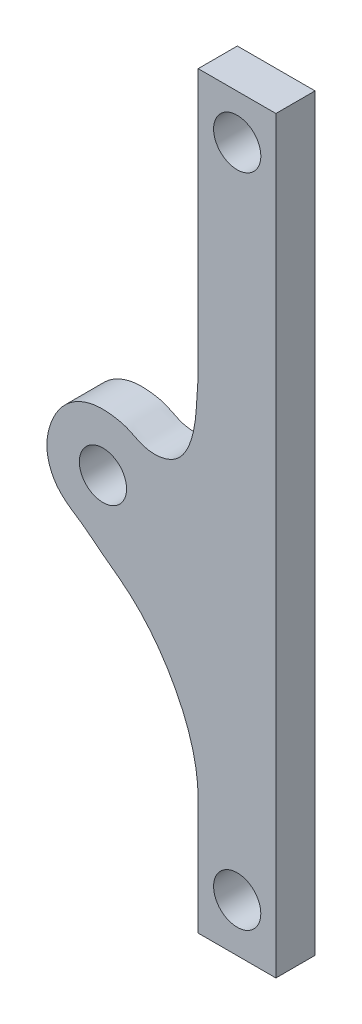
ISO-10303-21;
HEADER;
FILE_DESCRIPTION(('STEP AP214'),'2;1');
FILE_NAME('part.step','',(''),(''),'','','');
FILE_SCHEMA(('AUTOMOTIVE_DESIGN { 1 0 10303 214 1 1 1 1 }'));
ENDSEC;
DATA;
#1=APPLICATION_CONTEXT('core data for automotive mechanical design processes');
#2=APPLICATION_PROTOCOL_DEFINITION('international standard','automotive_design',2000,#1);
#3=PRODUCT_CONTEXT('',#1,'mechanical');
#4=PRODUCT('Part','Part','',(#3));
#5=PRODUCT_RELATED_PRODUCT_CATEGORY('part','',(#4));
#6=PRODUCT_DEFINITION_FORMATION('','',#4);
#7=PRODUCT_DEFINITION_CONTEXT('part definition',#1,'design');
#8=PRODUCT_DEFINITION('design','',#6,#7);
#9=PRODUCT_DEFINITION_SHAPE('','',#8);
#10=(LENGTH_UNIT() NAMED_UNIT(*) SI_UNIT(.MILLI.,.METRE.));
#11=(NAMED_UNIT(*) PLANE_ANGLE_UNIT() SI_UNIT($,.RADIAN.));
#12=(NAMED_UNIT(*) SI_UNIT($,.STERADIAN.) SOLID_ANGLE_UNIT());
#13=UNCERTAINTY_MEASURE_WITH_UNIT(LENGTH_MEASURE(1.E-05),#10,'distance_accuracy_value','');
#14=(GEOMETRIC_REPRESENTATION_CONTEXT(3) GLOBAL_UNCERTAINTY_ASSIGNED_CONTEXT((#13)) GLOBAL_UNIT_ASSIGNED_CONTEXT((#10,
#11,#12)) REPRESENTATION_CONTEXT('',''));
#15=CARTESIAN_POINT('',(0.,0.,0.));
#16=DIRECTION('',(0.,0.,1.));
#17=DIRECTION('',(1.,0.,0.));
#18=AXIS2_PLACEMENT_3D('',#15,#16,#17);
#19=CARTESIAN_POINT('',(14.3241601278238,9.85253651703689,2.53));
#20=CARTESIAN_POINT('',(14.329457987155,11.8171616213795,2.53));
#21=CARTESIAN_POINT('',(13.2118954990796,15.314671373828,2.53));
#22=CARTESIAN_POINT('',(10.5227436913193,18.8487191588496,2.53));
#23=CARTESIAN_POINT('',(8.13326193199438,20.4876335551474,2.53));
#24=CARTESIAN_POINT('',(6.78454321832392,21.6322267702998,2.53));
#25=CARTESIAN_POINT('',(5.3437883414213,22.4556992123123,2.53));
#26=CARTESIAN_POINT('',(4.34815831766203,24.277098970188,2.53));
#27=CARTESIAN_POINT('',(4.70477046266301,26.4127424818023,2.53));
#28=CARTESIAN_POINT('',(5.97966936213651,28.1104366216431,2.53));
#29=CARTESIAN_POINT('',(7.48996229676358,28.6692912361335,2.53));
#30=CARTESIAN_POINT('',(8.73588194584117,28.6113653945058,2.53));
#31=CARTESIAN_POINT('',(9.72355422953002,28.4327084800523,2.53));
#32=CARTESIAN_POINT('',(10.5650873261809,27.9118096328136,2.53));
#33=CARTESIAN_POINT('',(11.7145107145276,27.6803174652671,2.53));
#34=CARTESIAN_POINT('',(12.9767761080277,28.0655402375854,2.53));
#35=CARTESIAN_POINT('',(14.3182366534119,30.1466805784571,2.53));
#36=CARTESIAN_POINT('',(14.1884069634423,32.1450848120604,2.53));
#37=CARTESIAN_POINT('',(14.3241601278238,33.5611234431157,2.53));
#38=B_SPLINE_CURVE_WITH_KNOTS('',3,(#19,#20,#21,#22,#23,#24,#25,#26,#27,#28,#29,#30,#31,#32,#33,
#34,#35,#36,#37),.UNSPECIFIED.,.F.,.F.,(4,1,1,1,1,1,1,1,1,1,1,1,1,1,1,1,4),(0.,
0.165877522271735,0.310250800673476,0.370355979087688,0.413778475722413,0.462189974270297,
0.510332351118032,0.581700783630295,0.634410755249737,0.686591695711737,0.711498906896285,
0.741308267119988,0.771463134737927,0.795069042742029,0.840627944082532,0.873607157391937,1.),.UNSPECIFIED.);
#39=DIRECTION('',(0.,0.,-1.));
#40=VECTOR('',#39,1.);
#41=SURFACE_OF_LINEAR_EXTRUSION('',#38,#40);
#42=CARTESIAN_POINT('',(14.3241601278238,9.85253651703689,0.));
#43=CARTESIAN_POINT('',(14.329457987155,11.8171616213795,0.));
#44=CARTESIAN_POINT('',(13.2118954990796,15.314671373828,0.));
#45=CARTESIAN_POINT('',(10.5227436913193,18.8487191588496,0.));
#46=CARTESIAN_POINT('',(8.13326193199438,20.4876335551474,0.));
#47=CARTESIAN_POINT('',(6.78454321832392,21.6322267702998,0.));
#48=CARTESIAN_POINT('',(5.3437883414213,22.4556992123123,0.));
#49=CARTESIAN_POINT('',(4.34815831766203,24.277098970188,0.));
#50=CARTESIAN_POINT('',(4.70477046266301,26.4127424818023,0.));
#51=CARTESIAN_POINT('',(5.97966936213651,28.1104366216431,0.));
#52=CARTESIAN_POINT('',(7.48996229676358,28.6692912361335,0.));
#53=CARTESIAN_POINT('',(8.73588194584117,28.6113653945058,0.));
#54=CARTESIAN_POINT('',(9.72355422953002,28.4327084800523,0.));
#55=CARTESIAN_POINT('',(10.5650873261809,27.9118096328136,0.));
#56=CARTESIAN_POINT('',(11.7145107145276,27.6803174652671,0.));
#57=CARTESIAN_POINT('',(12.9767761080277,28.0655402375854,0.));
#58=CARTESIAN_POINT('',(14.3182366534119,30.1466805784571,0.));
#59=CARTESIAN_POINT('',(14.1884069634423,32.1450848120604,0.));
#60=CARTESIAN_POINT('',(14.3241601278238,33.5611234431157,0.));
#61=B_SPLINE_CURVE_WITH_KNOTS('',3,(#42,#43,#44,#45,#46,#47,#48,#49,#50,#51,#52,#53,#54,#55,#56,
#57,#58,#59,#60),.UNSPECIFIED.,.F.,.F.,(4,1,1,1,1,1,1,1,1,1,1,1,1,1,1,1,4),(0.,
0.165877522271735,0.310250800673476,0.370355979087688,0.413778475722413,0.462189974270297,
0.510332351118032,0.581700783630295,0.634410755249737,0.686591695711737,0.711498906896285,
0.741308267119988,0.771463134737927,0.795069042742029,0.840627944082532,0.873607157391937,1.),.UNSPECIFIED.);
#62=CARTESIAN_POINT('',(14.3241601278238,9.85253651703689,0.));
#63=VERTEX_POINT('',#62);
#64=CARTESIAN_POINT('',(14.3241601278238,33.5611234431157,0.));
#65=VERTEX_POINT('',#64);
#66=EDGE_CURVE('E127',#63,#65,#61,.T.);
#67=ORIENTED_EDGE('',*,*,#66,.F.);
#68=DIRECTION('',(0.,0.,-1.));
#69=VECTOR('',#68,1.);
#70=CARTESIAN_POINT('',(14.3241601278238,9.85253651703689,2.53));
#71=LINE('',#70,#69);
#72=CARTESIAN_POINT('',(14.3241601278238,9.85253651703689,2.53));
#73=VERTEX_POINT('',#72);
#74=EDGE_CURVE('E11',#73,#63,#71,.T.);
#75=ORIENTED_EDGE('',*,*,#74,.F.);
#76=CARTESIAN_POINT('',(14.3241601278238,33.5611234431157,2.53));
#77=VERTEX_POINT('',#76);
#78=EDGE_CURVE('E151',#73,#77,#38,.T.);
#79=ORIENTED_EDGE('',*,*,#78,.T.);
#80=DIRECTION('',(0.,0.,-1.));
#81=VECTOR('',#80,1.);
#82=CARTESIAN_POINT('',(14.3241601278238,33.5611234431157,2.53));
#83=LINE('',#82,#81);
#84=EDGE_CURVE('E83',#77,#65,#83,.T.);
#85=ORIENTED_EDGE('',*,*,#84,.T.);
#86=EDGE_LOOP('',(#67,#75,#79,#85));
#87=FACE_BOUND('',#86,.T.);
#88=ADVANCED_FACE('F38',(#87),#41,.T.);
#89=CARTESIAN_POINT('',(14.3241601278238,0.,2.53));
#90=DIRECTION('',(1.,0.,0.));
#91=DIRECTION('',(0.,0.,-1.));
#92=AXIS2_PLACEMENT_3D('',#89,#90,#91);
#93=PLANE('',#92);
#94=DIRECTION('',(0.,-1.,0.));
#95=VECTOR('',#94,1.);
#96=CARTESIAN_POINT('',(14.3241601278238,0.,0.));
#97=LINE('',#96,#95);
#98=CARTESIAN_POINT('',(14.3241601278238,2.39854936115329,0.));
#99=VERTEX_POINT('',#98);
#100=EDGE_CURVE('E132',#63,#99,#97,.T.);
#101=ORIENTED_EDGE('',*,*,#100,.T.);
#102=DIRECTION('',(0.,0.,-1.));
#103=VECTOR('',#102,1.);
#104=CARTESIAN_POINT('',(14.3241601278238,2.39854936115329,2.53));
#105=LINE('',#104,#103);
#106=CARTESIAN_POINT('',(14.3241601278238,2.39854936115329,2.53));
#107=VERTEX_POINT('',#106);
#108=EDGE_CURVE('E47',#107,#99,#105,.T.);
#109=ORIENTED_EDGE('',*,*,#108,.F.);
#110=DIRECTION('',(0.,-1.,0.));
#111=VECTOR('',#110,1.);
#112=CARTESIAN_POINT('',(14.3241601278238,0.,2.53));
#113=LINE('',#112,#111);
#114=EDGE_CURVE('E117',#73,#107,#113,.T.);
#115=ORIENTED_EDGE('',*,*,#114,.F.);
#116=ORIENTED_EDGE('',*,*,#74,.T.);
#117=EDGE_LOOP('',(#101,#109,#115,#116));
#118=FACE_BOUND('',#117,.T.);
#119=ADVANCED_FACE('F160',(#118),#93,.F.);
#120=CARTESIAN_POINT('',(0.,2.39854936115329,2.53));
#121=DIRECTION('',(0.,-1.,0.));
#122=DIRECTION('',(0.,0.,-1.));
#123=AXIS2_PLACEMENT_3D('',#120,#121,#122);
#124=PLANE('',#123);
#125=DIRECTION('',(-1.,0.,0.));
#126=VECTOR('',#125,1.);
#127=CARTESIAN_POINT('',(0.,2.39854936115329,0.));
#128=LINE('',#127,#126);
#129=CARTESIAN_POINT('',(19.3441601278238,2.39854936115329,0.));
#130=VERTEX_POINT('',#129);
#131=EDGE_CURVE('E139',#130,#99,#128,.T.);
#132=ORIENTED_EDGE('',*,*,#131,.F.);
#133=DIRECTION('',(0.,0.,-1.));
#134=VECTOR('',#133,1.);
#135=CARTESIAN_POINT('',(19.3441601278238,2.39854936115329,2.53));
#136=LINE('',#135,#134);
#137=CARTESIAN_POINT('',(19.3441601278238,2.39854936115329,2.53));
#138=VERTEX_POINT('',#137);
#139=EDGE_CURVE('E105',#138,#130,#136,.T.);
#140=ORIENTED_EDGE('',*,*,#139,.F.);
#141=DIRECTION('',(-1.,0.,0.));
#142=VECTOR('',#141,1.);
#143=CARTESIAN_POINT('',(0.,2.39854936115329,2.53));
#144=LINE('',#143,#142);
#145=EDGE_CURVE('E115',#138,#107,#144,.T.);
#146=ORIENTED_EDGE('',*,*,#145,.T.);
#147=ORIENTED_EDGE('',*,*,#108,.T.);
#148=EDGE_LOOP('',(#132,#140,#146,#147));
#149=FACE_BOUND('',#148,.T.);
#150=ADVANCED_FACE('F157',(#149),#124,.T.);
#151=CARTESIAN_POINT('',(19.3441601278238,0.,2.53));
#152=DIRECTION('',(1.,0.,0.));
#153=DIRECTION('',(0.,0.,-1.));
#154=AXIS2_PLACEMENT_3D('',#151,#152,#153);
#155=PLANE('',#154);
#156=DIRECTION('',(0.,-1.,0.));
#157=VECTOR('',#156,1.);
#158=CARTESIAN_POINT('',(19.3441601278238,0.,0.));
#159=LINE('',#158,#157);
#160=CARTESIAN_POINT('',(19.3441601278238,50.7585493611533,0.));
#161=VERTEX_POINT('',#160);
#162=EDGE_CURVE('E104',#161,#130,#159,.T.);
#163=ORIENTED_EDGE('',*,*,#162,.F.);
#164=DIRECTION('',(0.,0.,-1.));
#165=VECTOR('',#164,1.);
#166=CARTESIAN_POINT('',(19.3441601278238,50.7585493611533,2.53));
#167=LINE('',#166,#165);
#168=CARTESIAN_POINT('',(19.3441601278238,50.7585493611533,2.53));
#169=VERTEX_POINT('',#168);
#170=EDGE_CURVE('E98',#169,#161,#167,.T.);
#171=ORIENTED_EDGE('',*,*,#170,.F.);
#172=DIRECTION('',(0.,-1.,0.));
#173=VECTOR('',#172,1.);
#174=CARTESIAN_POINT('',(19.3441601278238,0.,2.53));
#175=LINE('',#174,#173);
#176=EDGE_CURVE('E102',#169,#138,#175,.T.);
#177=ORIENTED_EDGE('',*,*,#176,.T.);
#178=ORIENTED_EDGE('',*,*,#139,.T.);
#179=EDGE_LOOP('',(#163,#171,#177,#178));
#180=FACE_BOUND('',#179,.T.);
#181=ADVANCED_FACE('F100',(#180),#155,.T.);
#182=CARTESIAN_POINT('',(0.,50.7585493611533,2.53));
#183=DIRECTION('',(0.,-1.,0.));
#184=DIRECTION('',(0.,0.,-1.));
#185=AXIS2_PLACEMENT_3D('',#182,#183,#184);
#186=PLANE('',#185);
#187=DIRECTION('',(-1.,0.,0.));
#188=VECTOR('',#187,1.);
#189=CARTESIAN_POINT('',(0.,50.7585493611533,0.));
#190=LINE('',#189,#188);
#191=CARTESIAN_POINT('',(14.3241601278238,50.7585493611533,0.));
#192=VERTEX_POINT('',#191);
#193=EDGE_CURVE('E76',#161,#192,#190,.T.);
#194=ORIENTED_EDGE('',*,*,#193,.T.);
#195=DIRECTION('',(0.,0.,-1.));
#196=VECTOR('',#195,1.);
#197=CARTESIAN_POINT('',(14.3241601278238,50.7585493611533,2.53));
#198=LINE('',#197,#196);
#199=CARTESIAN_POINT('',(14.3241601278238,50.7585493611533,2.53));
#200=VERTEX_POINT('',#199);
#201=EDGE_CURVE('E106',#200,#192,#198,.T.);
#202=ORIENTED_EDGE('',*,*,#201,.F.);
#203=DIRECTION('',(-1.,0.,0.));
#204=VECTOR('',#203,1.);
#205=CARTESIAN_POINT('',(0.,50.7585493611533,2.53));
#206=LINE('',#205,#204);
#207=EDGE_CURVE('E108',#169,#200,#206,.T.);
#208=ORIENTED_EDGE('',*,*,#207,.F.);
#209=ORIENTED_EDGE('',*,*,#170,.T.);
#210=EDGE_LOOP('',(#194,#202,#208,#209));
#211=FACE_BOUND('',#210,.T.);
#212=ADVANCED_FACE('F109',(#211),#186,.F.);
#213=CARTESIAN_POINT('',(8.17453293376571,24.9354867008289,2.53));
#214=DIRECTION('',(0.,0.,-1.));
#215=DIRECTION('',(-1.,0.,0.));
#216=AXIS2_PLACEMENT_3D('',#213,#214,#215);
#217=CYLINDRICAL_SURFACE('',#216,1.525);
#218=CARTESIAN_POINT('',(8.17453293376571,24.9354867008289,2.53));
#219=DIRECTION('',(0.,0.,1.));
#220=DIRECTION('',(1.,0.,0.));
#221=AXIS2_PLACEMENT_3D('',#218,#219,#220);
#222=CIRCLE('',#221,1.525);
#223=CARTESIAN_POINT('',(9.69953293376571,24.9354867008289,2.53));
#224=VERTEX_POINT('',#223);
#225=EDGE_CURVE('E121',#224,#224,#222,.T.);
#226=ORIENTED_EDGE('',*,*,#225,.T.);
#227=EDGE_LOOP('',(#226));
#228=FACE_BOUND('',#227,.T.);
#229=CARTESIAN_POINT('',(8.17453293376571,24.9354867008289,0.));
#230=DIRECTION('',(0.,0.,1.));
#231=DIRECTION('',(1.,0.,0.));
#232=AXIS2_PLACEMENT_3D('',#229,#230,#231);
#233=CIRCLE('',#232,1.525);
#234=CARTESIAN_POINT('',(9.69953293376571,24.9354867008289,0.));
#235=VERTEX_POINT('',#234);
#236=EDGE_CURVE('E145',#235,#235,#233,.T.);
#237=ORIENTED_EDGE('',*,*,#236,.F.);
#238=EDGE_LOOP('',(#237));
#239=FACE_BOUND('',#238,.T.);
#240=ADVANCED_FACE('F206',(#228,#239),#217,.F.);
#241=EDGE_CURVE('E140',#192,#65,#97,.T.);
#242=ORIENTED_EDGE('',*,*,#241,.T.);
#243=ORIENTED_EDGE('',*,*,#84,.F.);
#244=EDGE_CURVE('E55',#200,#77,#113,.T.);
#245=ORIENTED_EDGE('',*,*,#244,.F.);
#246=ORIENTED_EDGE('',*,*,#201,.T.);
#247=EDGE_LOOP('',(#242,#243,#245,#246));
#248=FACE_BOUND('',#247,.T.);
#249=ADVANCED_FACE('F166',(#248),#93,.F.);
#250=CARTESIAN_POINT('',(16.8448572465298,5.51249670319575,2.53));
#251=DIRECTION('',(0.,0.,-1.));
#252=DIRECTION('',(-1.,0.,0.));
#253=AXIS2_PLACEMENT_3D('',#250,#251,#252);
#254=CYLINDRICAL_SURFACE('',#253,1.525);
#255=CARTESIAN_POINT('',(16.8448572465298,5.51249670319575,2.53));
#256=DIRECTION('',(0.,0.,1.));
#257=DIRECTION('',(1.,0.,0.));
#258=AXIS2_PLACEMENT_3D('',#255,#256,#257);
#259=CIRCLE('',#258,1.525);
#260=CARTESIAN_POINT('',(18.3698572465298,5.51249670319575,2.53));
#261=VERTEX_POINT('',#260);
#262=EDGE_CURVE('E124',#261,#261,#259,.T.);
#263=ORIENTED_EDGE('',*,*,#262,.T.);
#264=EDGE_LOOP('',(#263));
#265=FACE_BOUND('',#264,.T.);
#266=CARTESIAN_POINT('',(16.8448572465298,5.51249670319575,0.));
#267=DIRECTION('',(0.,0.,1.));
#268=DIRECTION('',(1.,0.,0.));
#269=AXIS2_PLACEMENT_3D('',#266,#267,#268);
#270=CIRCLE('',#269,1.525);
#271=CARTESIAN_POINT('',(18.3698572465298,5.51249670319575,0.));
#272=VERTEX_POINT('',#271);
#273=EDGE_CURVE('E148',#272,#272,#270,.T.);
#274=ORIENTED_EDGE('',*,*,#273,.F.);
#275=EDGE_LOOP('',(#274));
#276=FACE_BOUND('',#275,.T.);
#277=ADVANCED_FACE('F192',(#265,#276),#254,.F.);
#278=CARTESIAN_POINT('',(0.,0.,2.53));
#279=DIRECTION('',(0.,0.,1.));
#280=DIRECTION('',(1.,0.,0.));
#281=AXIS2_PLACEMENT_3D('',#278,#279,#280);
#282=PLANE('',#281);
#283=CARTESIAN_POINT('',(16.8448572465298,47.8860698366347,2.53));
#284=DIRECTION('',(0.,0.,-1.));
#285=DIRECTION('',(-1.,0.,0.));
#286=AXIS2_PLACEMENT_3D('',#283,#284,#285);
#287=CIRCLE('',#286,1.525);
#288=CARTESIAN_POINT('',(15.3198572465298,47.8860698366347,2.53));
#289=VERTEX_POINT('',#288);
#290=EDGE_CURVE('E133',#289,#289,#287,.T.);
#291=ORIENTED_EDGE('',*,*,#290,.T.);
#292=EDGE_LOOP('',(#291));
#293=FACE_BOUND('',#292,.T.);
#294=ORIENTED_EDGE('',*,*,#78,.F.);
#295=ORIENTED_EDGE('',*,*,#114,.T.);
#296=ORIENTED_EDGE('',*,*,#145,.F.);
#297=ORIENTED_EDGE('',*,*,#176,.F.);
#298=ORIENTED_EDGE('',*,*,#207,.T.);
#299=ORIENTED_EDGE('',*,*,#244,.T.);
#300=EDGE_LOOP('',(#294,#295,#296,#297,#298,#299));
#301=FACE_BOUND('',#300,.T.);
#302=ORIENTED_EDGE('',*,*,#225,.F.);
#303=EDGE_LOOP('',(#302));
#304=FACE_BOUND('',#303,.T.);
#305=ORIENTED_EDGE('',*,*,#262,.F.);
#306=EDGE_LOOP('',(#305));
#307=FACE_BOUND('',#306,.T.);
#308=ADVANCED_FACE('F112',(#293,#301,#304,#307),#282,.T.);
#309=CARTESIAN_POINT('',(0.,0.,0.));
#310=DIRECTION('',(0.,0.,1.));
#311=DIRECTION('',(1.,0.,0.));
#312=AXIS2_PLACEMENT_3D('',#309,#310,#311);
#313=PLANE('',#312);
#314=CARTESIAN_POINT('',(16.8448572465298,47.8860698366347,0.));
#315=DIRECTION('',(0.,0.,-1.));
#316=DIRECTION('',(-1.,0.,0.));
#317=AXIS2_PLACEMENT_3D('',#314,#315,#316);
#318=CIRCLE('',#317,1.525);
#319=CARTESIAN_POINT('',(15.3198572465298,47.8860698366347,0.));
#320=VERTEX_POINT('',#319);
#321=EDGE_CURVE('E171',#320,#320,#318,.T.);
#322=ORIENTED_EDGE('',*,*,#321,.F.);
#323=EDGE_LOOP('',(#322));
#324=FACE_BOUND('',#323,.T.);
#325=ORIENTED_EDGE('',*,*,#66,.T.);
#326=ORIENTED_EDGE('',*,*,#241,.F.);
#327=ORIENTED_EDGE('',*,*,#193,.F.);
#328=ORIENTED_EDGE('',*,*,#162,.T.);
#329=ORIENTED_EDGE('',*,*,#131,.T.);
#330=ORIENTED_EDGE('',*,*,#100,.F.);
#331=EDGE_LOOP('',(#325,#326,#327,#328,#329,#330));
#332=FACE_BOUND('',#331,.T.);
#333=ORIENTED_EDGE('',*,*,#236,.T.);
#334=EDGE_LOOP('',(#333));
#335=FACE_BOUND('',#334,.T.);
#336=ORIENTED_EDGE('',*,*,#273,.T.);
#337=EDGE_LOOP('',(#336));
#338=FACE_BOUND('',#337,.T.);
#339=ADVANCED_FACE('F162',(#324,#332,#335,#338),#313,.F.);
#340=CARTESIAN_POINT('',(16.8448572465298,47.8860698366347,2.53));
#341=DIRECTION('',(0.,0.,-1.));
#342=DIRECTION('',(-1.,0.,0.));
#343=AXIS2_PLACEMENT_3D('',#340,#341,#342);
#344=CYLINDRICAL_SURFACE('',#343,1.525);
#345=ORIENTED_EDGE('',*,*,#290,.F.);
#346=EDGE_LOOP('',(#345));
#347=FACE_BOUND('',#346,.T.);
#348=ORIENTED_EDGE('',*,*,#321,.T.);
#349=EDGE_LOOP('',(#348));
#350=FACE_BOUND('',#349,.T.);
#351=ADVANCED_FACE('F181',(#347,#350),#344,.F.);
#352=CLOSED_SHELL('',(#88,#119,#150,#181,#212,#240,#249,#277,#308,#339,#351));
#353=MANIFOLD_SOLID_BREP('B2',#352);
#354=ADVANCED_BREP_SHAPE_REPRESENTATION('',(#18,#353),#14);
#355=SHAPE_DEFINITION_REPRESENTATION(#9,#354);
ENDSEC;
END-ISO-10303-21;
